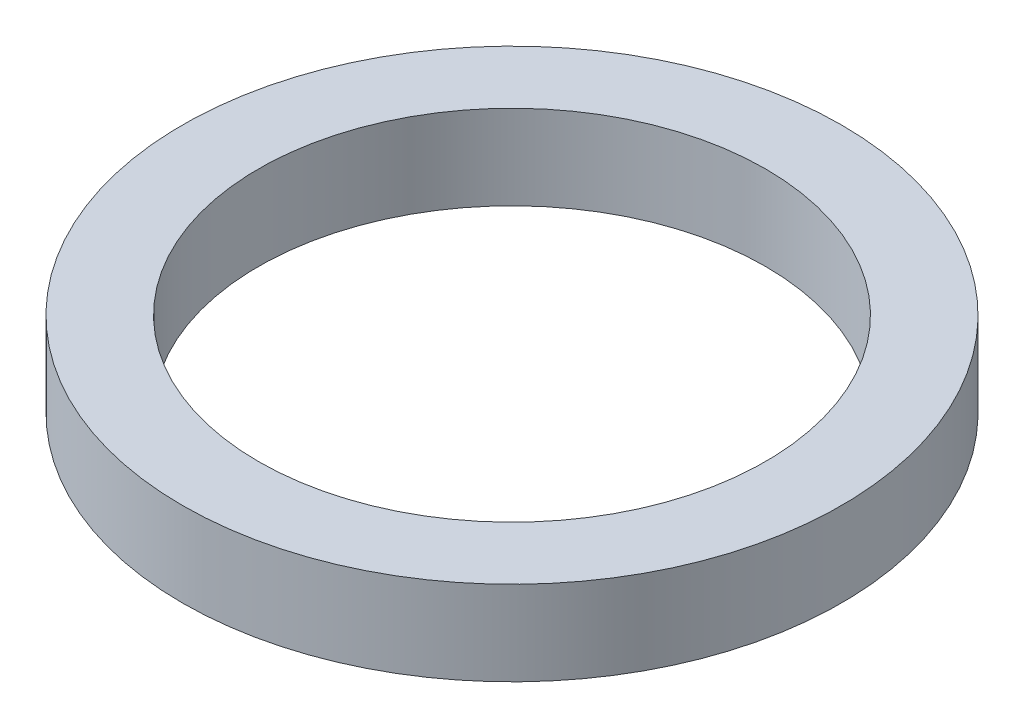
ISO-10303-21;
HEADER;
FILE_DESCRIPTION(('STEP AP214'),'2;1');
FILE_NAME('part.step','',(''),(''),'','','');
FILE_SCHEMA(('AUTOMOTIVE_DESIGN { 1 0 10303 214 1 1 1 1 }'));
ENDSEC;
DATA;
#1=APPLICATION_CONTEXT('core data for automotive mechanical design processes');
#2=APPLICATION_PROTOCOL_DEFINITION('international standard','automotive_design',2000,#1);
#3=PRODUCT_CONTEXT('',#1,'mechanical');
#4=PRODUCT('Part','Part','',(#3));
#5=PRODUCT_RELATED_PRODUCT_CATEGORY('part','',(#4));
#6=PRODUCT_DEFINITION_FORMATION('','',#4);
#7=PRODUCT_DEFINITION_CONTEXT('part definition',#1,'design');
#8=PRODUCT_DEFINITION('design','',#6,#7);
#9=PRODUCT_DEFINITION_SHAPE('','',#8);
#10=(LENGTH_UNIT() NAMED_UNIT(*) SI_UNIT(.MILLI.,.METRE.));
#11=(NAMED_UNIT(*) PLANE_ANGLE_UNIT() SI_UNIT($,.RADIAN.));
#12=(NAMED_UNIT(*) SI_UNIT($,.STERADIAN.) SOLID_ANGLE_UNIT());
#13=UNCERTAINTY_MEASURE_WITH_UNIT(LENGTH_MEASURE(1.E-05),#10,'distance_accuracy_value','');
#14=(GEOMETRIC_REPRESENTATION_CONTEXT(3) GLOBAL_UNCERTAINTY_ASSIGNED_CONTEXT((#13)) GLOBAL_UNIT_ASSIGNED_CONTEXT((#10,
#11,#12)) REPRESENTATION_CONTEXT('',''));
#15=CARTESIAN_POINT('',(0.,0.,0.));
#16=DIRECTION('',(0.,0.,1.));
#17=DIRECTION('',(1.,0.,0.));
#18=AXIS2_PLACEMENT_3D('',#15,#16,#17);
#19=CARTESIAN_POINT('',(0.,5.,0.));
#20=DIRECTION('',(0.,1.,0.));
#21=DIRECTION('',(0.,0.,1.));
#22=AXIS2_PLACEMENT_3D('',#19,#20,#21);
#23=PLANE('',#22);
#24=CARTESIAN_POINT('',(0.,5.,0.));
#25=DIRECTION('',(0.,1.,0.));
#26=DIRECTION('',(0.,0.,1.));
#27=AXIS2_PLACEMENT_3D('',#24,#25,#26);
#28=CIRCLE('',#27,39.);
#29=CARTESIAN_POINT('',(0.,5.,39.));
#30=VERTEX_POINT('',#29);
#31=EDGE_CURVE('E10',#30,#30,#28,.T.);
#32=ORIENTED_EDGE('',*,*,#31,.T.);
#33=EDGE_LOOP('',(#32));
#34=FACE_BOUND('',#33,.T.);
#35=CARTESIAN_POINT('',(0.,5.,0.));
#36=DIRECTION('',(0.,1.,0.));
#37=DIRECTION('',(0.,0.,1.));
#38=AXIS2_PLACEMENT_3D('',#35,#36,#37);
#39=CIRCLE('',#38,30.);
#40=CARTESIAN_POINT('',(0.,5.,30.));
#41=VERTEX_POINT('',#40);
#42=EDGE_CURVE('E48',#41,#41,#39,.T.);
#43=ORIENTED_EDGE('',*,*,#42,.F.);
#44=EDGE_LOOP('',(#43));
#45=FACE_BOUND('',#44,.T.);
#46=ADVANCED_FACE('F40',(#34,#45),#23,.T.);
#47=CARTESIAN_POINT('',(0.,-5.,0.));
#48=DIRECTION('',(0.,1.,0.));
#49=DIRECTION('',(0.,0.,1.));
#50=AXIS2_PLACEMENT_3D('',#47,#48,#49);
#51=PLANE('',#50);
#52=CARTESIAN_POINT('',(0.,-5.,0.));
#53=DIRECTION('',(0.,1.,0.));
#54=DIRECTION('',(0.,0.,1.));
#55=AXIS2_PLACEMENT_3D('',#52,#53,#54);
#56=CIRCLE('',#55,39.);
#57=CARTESIAN_POINT('',(0.,-5.,39.));
#58=VERTEX_POINT('',#57);
#59=EDGE_CURVE('E41',#58,#58,#56,.T.);
#60=ORIENTED_EDGE('',*,*,#59,.F.);
#61=EDGE_LOOP('',(#60));
#62=FACE_BOUND('',#61,.T.);
#63=CARTESIAN_POINT('',(0.,-5.,0.));
#64=DIRECTION('',(0.,1.,0.));
#65=DIRECTION('',(0.,0.,1.));
#66=AXIS2_PLACEMENT_3D('',#63,#64,#65);
#67=CIRCLE('',#66,30.);
#68=CARTESIAN_POINT('',(0.,-5.,30.));
#69=VERTEX_POINT('',#68);
#70=EDGE_CURVE('E49',#69,#69,#67,.T.);
#71=ORIENTED_EDGE('',*,*,#70,.T.);
#72=EDGE_LOOP('',(#71));
#73=FACE_BOUND('',#72,.T.);
#74=ADVANCED_FACE('F58',(#62,#73),#51,.F.);
#75=CARTESIAN_POINT('',(0.,5.,0.));
#76=DIRECTION('',(0.,-1.,0.));
#77=DIRECTION('',(0.,0.,-1.));
#78=AXIS2_PLACEMENT_3D('',#75,#76,#77);
#79=CYLINDRICAL_SURFACE('',#78,39.);
#80=ORIENTED_EDGE('',*,*,#31,.F.);
#81=EDGE_LOOP('',(#80));
#82=FACE_BOUND('',#81,.T.);
#83=ORIENTED_EDGE('',*,*,#59,.T.);
#84=EDGE_LOOP('',(#83));
#85=FACE_BOUND('',#84,.T.);
#86=ADVANCED_FACE('F39',(#82,#85),#79,.T.);
#87=CARTESIAN_POINT('',(0.,5.,0.));
#88=DIRECTION('',(0.,-1.,0.));
#89=DIRECTION('',(0.,0.,-1.));
#90=AXIS2_PLACEMENT_3D('',#87,#88,#89);
#91=CYLINDRICAL_SURFACE('',#90,30.);
#92=ORIENTED_EDGE('',*,*,#42,.T.);
#93=EDGE_LOOP('',(#92));
#94=FACE_BOUND('',#93,.T.);
#95=ORIENTED_EDGE('',*,*,#70,.F.);
#96=EDGE_LOOP('',(#95));
#97=FACE_BOUND('',#96,.T.);
#98=ADVANCED_FACE('F57',(#94,#97),#91,.F.);
#99=CLOSED_SHELL('',(#46,#74,#86,#98));
#100=MANIFOLD_SOLID_BREP('B2',#99);
#101=ADVANCED_BREP_SHAPE_REPRESENTATION('',(#18,#100),#14);
#102=SHAPE_DEFINITION_REPRESENTATION(#9,#101);
ENDSEC;
END-ISO-10303-21;
